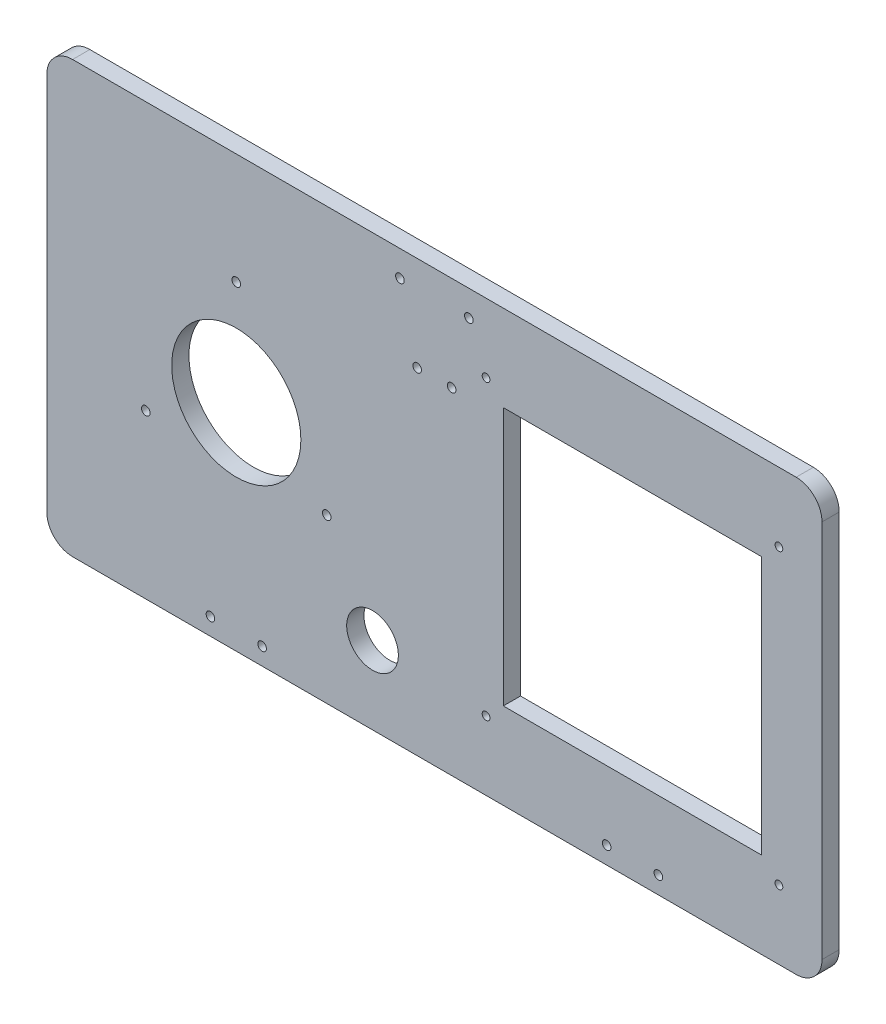
ISO-10303-21;
HEADER;
FILE_DESCRIPTION(('STEP AP214'),'2;1');
FILE_NAME('part.step','',(''),(''),'','','');
FILE_SCHEMA(('AUTOMOTIVE_DESIGN { 1 0 10303 214 1 1 1 1 }'));
ENDSEC;
DATA;
#1=APPLICATION_CONTEXT('core data for automotive mechanical design processes');
#2=APPLICATION_PROTOCOL_DEFINITION('international standard','automotive_design',2000,#1);
#3=PRODUCT_CONTEXT('',#1,'mechanical');
#4=PRODUCT('Part','Part','',(#3));
#5=PRODUCT_RELATED_PRODUCT_CATEGORY('part','',(#4));
#6=PRODUCT_DEFINITION_FORMATION('','',#4);
#7=PRODUCT_DEFINITION_CONTEXT('part definition',#1,'design');
#8=PRODUCT_DEFINITION('design','',#6,#7);
#9=PRODUCT_DEFINITION_SHAPE('','',#8);
#10=(LENGTH_UNIT() NAMED_UNIT(*) SI_UNIT(.MILLI.,.METRE.));
#11=(NAMED_UNIT(*) PLANE_ANGLE_UNIT() SI_UNIT($,.RADIAN.));
#12=(NAMED_UNIT(*) SI_UNIT($,.STERADIAN.) SOLID_ANGLE_UNIT());
#13=UNCERTAINTY_MEASURE_WITH_UNIT(LENGTH_MEASURE(1.E-05),#10,'distance_accuracy_value','');
#14=(GEOMETRIC_REPRESENTATION_CONTEXT(3) GLOBAL_UNCERTAINTY_ASSIGNED_CONTEXT((#13)) GLOBAL_UNIT_ASSIGNED_CONTEXT((#10,
#11,#12)) REPRESENTATION_CONTEXT('',''));
#15=CARTESIAN_POINT('',(0.,0.,0.));
#16=DIRECTION('',(0.,0.,1.));
#17=DIRECTION('',(1.,0.,0.));
#18=AXIS2_PLACEMENT_3D('',#15,#16,#17);
#19=CARTESIAN_POINT('',(435.,235.,10.));
#20=DIRECTION('',(0.,0.,-1.));
#21=DIRECTION('',(-1.,0.,0.));
#22=AXIS2_PLACEMENT_3D('',#19,#20,#21);
#23=PLANE('',#22);
#24=CARTESIAN_POINT('',(435.,235.,10.));
#25=DIRECTION('',(0.,0.,1.));
#26=DIRECTION('',(-1.,0.,0.));
#27=AXIS2_PLACEMENT_3D('',#24,#25,#26);
#28=CIRCLE('',#27,15.);
#29=CARTESIAN_POINT('',(450.,235.,10.));
#30=VERTEX_POINT('',#29);
#31=CARTESIAN_POINT('',(435.,250.,10.));
#32=VERTEX_POINT('',#31);
#33=EDGE_CURVE('E180',#30,#32,#28,.T.);
#34=ORIENTED_EDGE('',*,*,#33,.T.);
#35=DIRECTION('',(-1.,0.,0.));
#36=VECTOR('',#35,1.);
#37=CARTESIAN_POINT('',(15.,250.,10.));
#38=LINE('',#37,#36);
#39=CARTESIAN_POINT('',(15.,250.,10.));
#40=VERTEX_POINT('',#39);
#41=EDGE_CURVE('E184',#32,#40,#38,.T.);
#42=ORIENTED_EDGE('',*,*,#41,.T.);
#43=CARTESIAN_POINT('',(15.,235.,10.));
#44=DIRECTION('',(0.,0.,1.));
#45=DIRECTION('',(-1.,0.,0.));
#46=AXIS2_PLACEMENT_3D('',#43,#44,#45);
#47=CIRCLE('',#46,15.);
#48=CARTESIAN_POINT('',(0.,235.,10.));
#49=VERTEX_POINT('',#48);
#50=EDGE_CURVE('E188',#40,#49,#47,.T.);
#51=ORIENTED_EDGE('',*,*,#50,.T.);
#52=DIRECTION('',(0.,-1.,0.));
#53=VECTOR('',#52,1.);
#54=CARTESIAN_POINT('',(0.,15.0000000000001,10.));
#55=LINE('',#54,#53);
#56=CARTESIAN_POINT('',(0.,15.0000000000001,10.));
#57=VERTEX_POINT('',#56);
#58=EDGE_CURVE('E191',#49,#57,#55,.T.);
#59=ORIENTED_EDGE('',*,*,#58,.T.);
#60=CARTESIAN_POINT('',(15.,15.,10.));
#61=DIRECTION('',(0.,0.,1.));
#62=DIRECTION('',(-1.,0.,0.));
#63=AXIS2_PLACEMENT_3D('',#60,#61,#62);
#64=CIRCLE('',#63,15.);
#65=CARTESIAN_POINT('',(15.0000000000001,0.,10.));
#66=VERTEX_POINT('',#65);
#67=EDGE_CURVE('E194',#57,#66,#64,.T.);
#68=ORIENTED_EDGE('',*,*,#67,.T.);
#69=DIRECTION('',(1.,0.,0.));
#70=VECTOR('',#69,1.);
#71=CARTESIAN_POINT('',(15.0000000000001,0.,10.));
#72=LINE('',#71,#70);
#73=CARTESIAN_POINT('',(435.,0.,10.));
#74=VERTEX_POINT('',#73);
#75=EDGE_CURVE('E197',#66,#74,#72,.T.);
#76=ORIENTED_EDGE('',*,*,#75,.T.);
#77=CARTESIAN_POINT('',(435.,15.,10.));
#78=DIRECTION('',(0.,0.,1.));
#79=DIRECTION('',(1.,0.,0.));
#80=AXIS2_PLACEMENT_3D('',#77,#78,#79);
#81=CIRCLE('',#80,15.);
#82=CARTESIAN_POINT('',(450.,15.,10.));
#83=VERTEX_POINT('',#82);
#84=EDGE_CURVE('E200',#74,#83,#81,.T.);
#85=ORIENTED_EDGE('',*,*,#84,.T.);
#86=DIRECTION('',(0.,1.,0.));
#87=VECTOR('',#86,1.);
#88=CARTESIAN_POINT('',(450.,15.,10.));
#89=LINE('',#88,#87);
#90=EDGE_CURVE('E203',#83,#30,#89,.T.);
#91=ORIENTED_EDGE('',*,*,#90,.T.);
#92=EDGE_LOOP('',(#34,#42,#51,#59,#68,#76,#85,#91));
#93=FACE_BOUND('',#92,.T.);
#94=DIRECTION('',(0.,-1.,0.));
#95=VECTOR('',#94,1.);
#96=CARTESIAN_POINT('',(265.,50.,10.));
#97=LINE('',#96,#95);
#98=CARTESIAN_POINT('',(265.,200.,10.));
#99=VERTEX_POINT('',#98);
#100=CARTESIAN_POINT('',(265.,50.,10.));
#101=VERTEX_POINT('',#100);
#102=EDGE_CURVE('E129',#99,#101,#97,.T.);
#103=ORIENTED_EDGE('',*,*,#102,.F.);
#104=DIRECTION('',(-1.,0.,0.));
#105=VECTOR('',#104,1.);
#106=CARTESIAN_POINT('',(265.,200.,10.));
#107=LINE('',#106,#105);
#108=CARTESIAN_POINT('',(415.,200.,10.));
#109=VERTEX_POINT('',#108);
#110=EDGE_CURVE('E156',#109,#99,#107,.T.);
#111=ORIENTED_EDGE('',*,*,#110,.F.);
#112=DIRECTION('',(0.,1.,0.));
#113=VECTOR('',#112,1.);
#114=CARTESIAN_POINT('',(415.,50.,10.));
#115=LINE('',#114,#113);
#116=CARTESIAN_POINT('',(415.,50.,10.));
#117=VERTEX_POINT('',#116);
#118=EDGE_CURVE('E152',#117,#109,#115,.T.);
#119=ORIENTED_EDGE('',*,*,#118,.F.);
#120=DIRECTION('',(1.,0.,0.));
#121=VECTOR('',#120,1.);
#122=CARTESIAN_POINT('',(265.,50.,10.));
#123=LINE('',#122,#121);
#124=EDGE_CURVE('E138',#101,#117,#123,.T.);
#125=ORIENTED_EDGE('',*,*,#124,.F.);
#126=EDGE_LOOP('',(#103,#111,#119,#125));
#127=FACE_BOUND('',#126,.T.);
#128=CARTESIAN_POINT('',(110.,185.621778264911,10.));
#129=DIRECTION('',(0.,0.,1.));
#130=DIRECTION('',(1.,0.,0.));
#131=AXIS2_PLACEMENT_3D('',#128,#129,#130);
#132=CIRCLE('',#131,2.50000000000001);
#133=CARTESIAN_POINT('',(112.5,185.621778264911,10.));
#134=VERTEX_POINT('',#133);
#135=EDGE_CURVE('E164',#134,#134,#132,.T.);
#136=ORIENTED_EDGE('',*,*,#135,.F.);
#137=EDGE_LOOP('',(#136));
#138=FACE_BOUND('',#137,.T.);
#139=CARTESIAN_POINT('',(57.5000000000001,94.6891108675446,10.));
#140=DIRECTION('',(0.,0.,1.));
#141=DIRECTION('',(1.,0.,0.));
#142=AXIS2_PLACEMENT_3D('',#139,#140,#141);
#143=CIRCLE('',#142,2.5);
#144=CARTESIAN_POINT('',(60.0000000000001,94.6891108675446,10.));
#145=VERTEX_POINT('',#144);
#146=EDGE_CURVE('E525',#145,#145,#143,.T.);
#147=ORIENTED_EDGE('',*,*,#146,.F.);
#148=EDGE_LOOP('',(#147));
#149=FACE_BOUND('',#148,.T.);
#150=CARTESIAN_POINT('',(162.5,94.6891108675446,10.));
#151=DIRECTION('',(0.,0.,1.));
#152=DIRECTION('',(1.,0.,0.));
#153=AXIS2_PLACEMENT_3D('',#150,#151,#152);
#154=CIRCLE('',#153,2.5);
#155=CARTESIAN_POINT('',(165.,94.6891108675446,10.));
#156=VERTEX_POINT('',#155);
#157=EDGE_CURVE('E517',#156,#156,#154,.T.);
#158=ORIENTED_EDGE('',*,*,#157,.F.);
#159=EDGE_LOOP('',(#158));
#160=FACE_BOUND('',#159,.T.);
#161=CARTESIAN_POINT('',(110.,125.,10.));
#162=DIRECTION('',(0.,0.,1.));
#163=DIRECTION('',(1.,0.,0.));
#164=AXIS2_PLACEMENT_3D('',#161,#162,#163);
#165=CIRCLE('',#164,37.5);
#166=CARTESIAN_POINT('',(147.5,125.,10.));
#167=VERTEX_POINT('',#166);
#168=EDGE_CURVE('E509',#167,#167,#165,.T.);
#169=ORIENTED_EDGE('',*,*,#168,.F.);
#170=EDGE_LOOP('',(#169));
#171=FACE_BOUND('',#170,.T.);
#172=CARTESIAN_POINT('',(325.,10.,10.));
#173=DIRECTION('',(0.,0.,1.));
#174=DIRECTION('',(1.,0.,0.));
#175=AXIS2_PLACEMENT_3D('',#172,#173,#174);
#176=CIRCLE('',#175,2.50000000000002);
#177=CARTESIAN_POINT('',(327.5,10.,10.));
#178=VERTEX_POINT('',#177);
#179=EDGE_CURVE('E501',#178,#178,#176,.T.);
#180=ORIENTED_EDGE('',*,*,#179,.F.);
#181=EDGE_LOOP('',(#180));
#182=FACE_BOUND('',#181,.T.);
#183=CARTESIAN_POINT('',(355.,10.,10.));
#184=DIRECTION('',(0.,0.,1.));
#185=DIRECTION('',(1.,0.,0.));
#186=AXIS2_PLACEMENT_3D('',#183,#184,#185);
#187=CIRCLE('',#186,2.50000000000002);
#188=CARTESIAN_POINT('',(357.5,10.,10.));
#189=VERTEX_POINT('',#188);
#190=EDGE_CURVE('E493',#189,#189,#187,.T.);
#191=ORIENTED_EDGE('',*,*,#190,.F.);
#192=EDGE_LOOP('',(#191));
#193=FACE_BOUND('',#192,.T.);
#194=CARTESIAN_POINT('',(95.0000000000001,9.99999999999994,10.));
#195=DIRECTION('',(0.,0.,1.));
#196=DIRECTION('',(-1.,0.,0.));
#197=AXIS2_PLACEMENT_3D('',#194,#195,#196);
#198=CIRCLE('',#197,2.5);
#199=CARTESIAN_POINT('',(92.5000000000001,9.99999999999994,10.));
#200=VERTEX_POINT('',#199);
#201=EDGE_CURVE('E485',#200,#200,#198,.T.);
#202=ORIENTED_EDGE('',*,*,#201,.F.);
#203=EDGE_LOOP('',(#202));
#204=FACE_BOUND('',#203,.T.);
#205=CARTESIAN_POINT('',(125.,9.99999999999994,10.));
#206=DIRECTION('',(0.,0.,1.));
#207=DIRECTION('',(-1.,0.,0.));
#208=AXIS2_PLACEMENT_3D('',#205,#206,#207);
#209=CIRCLE('',#208,2.5);
#210=CARTESIAN_POINT('',(122.5,9.99999999999994,10.));
#211=VERTEX_POINT('',#210);
#212=EDGE_CURVE('E477',#211,#211,#209,.T.);
#213=ORIENTED_EDGE('',*,*,#212,.F.);
#214=EDGE_LOOP('',(#213));
#215=FACE_BOUND('',#214,.T.);
#216=CARTESIAN_POINT('',(205.,235.,10.));
#217=DIRECTION('',(0.,0.,1.));
#218=DIRECTION('',(1.,0.,0.));
#219=AXIS2_PLACEMENT_3D('',#216,#217,#218);
#220=CIRCLE('',#219,2.5);
#221=CARTESIAN_POINT('',(207.5,235.,10.));
#222=VERTEX_POINT('',#221);
#223=EDGE_CURVE('E469',#222,#222,#220,.T.);
#224=ORIENTED_EDGE('',*,*,#223,.F.);
#225=EDGE_LOOP('',(#224));
#226=FACE_BOUND('',#225,.T.);
#227=CARTESIAN_POINT('',(245.,235.,10.));
#228=DIRECTION('',(0.,0.,1.));
#229=DIRECTION('',(1.,0.,0.));
#230=AXIS2_PLACEMENT_3D('',#227,#228,#229);
#231=CIRCLE('',#230,2.50000000000002);
#232=CARTESIAN_POINT('',(247.5,235.,10.));
#233=VERTEX_POINT('',#232);
#234=EDGE_CURVE('E461',#233,#233,#231,.T.);
#235=ORIENTED_EDGE('',*,*,#234,.F.);
#236=EDGE_LOOP('',(#235));
#237=FACE_BOUND('',#236,.T.);
#238=CARTESIAN_POINT('',(189.096460097782,45.,10.));
#239=DIRECTION('',(0.,0.,1.));
#240=DIRECTION('',(1.,0.,0.));
#241=AXIS2_PLACEMENT_3D('',#238,#239,#240);
#242=CIRCLE('',#241,15.);
#243=CARTESIAN_POINT('',(204.096460097782,45.,10.));
#244=VERTEX_POINT('',#243);
#245=EDGE_CURVE('E453',#244,#244,#242,.T.);
#246=ORIENTED_EDGE('',*,*,#245,.F.);
#247=EDGE_LOOP('',(#246));
#248=FACE_BOUND('',#247,.T.);
#249=CARTESIAN_POINT('',(425.,210.,10.));
#250=DIRECTION('',(0.,0.,1.));
#251=DIRECTION('',(1.,0.,0.));
#252=AXIS2_PLACEMENT_3D('',#249,#250,#251);
#253=CIRCLE('',#252,2.24999999999996);
#254=CARTESIAN_POINT('',(427.25,210.,10.));
#255=VERTEX_POINT('',#254);
#256=EDGE_CURVE('E445',#255,#255,#253,.T.);
#257=ORIENTED_EDGE('',*,*,#256,.F.);
#258=EDGE_LOOP('',(#257));
#259=FACE_BOUND('',#258,.T.);
#260=CARTESIAN_POINT('',(255.,210.,10.));
#261=DIRECTION('',(0.,0.,1.));
#262=DIRECTION('',(1.,0.,0.));
#263=AXIS2_PLACEMENT_3D('',#260,#261,#262);
#264=CIRCLE('',#263,2.24999999999996);
#265=CARTESIAN_POINT('',(257.25,210.,10.));
#266=VERTEX_POINT('',#265);
#267=EDGE_CURVE('E437',#266,#266,#264,.T.);
#268=ORIENTED_EDGE('',*,*,#267,.F.);
#269=EDGE_LOOP('',(#268));
#270=FACE_BOUND('',#269,.T.);
#271=CARTESIAN_POINT('',(255.,40.,10.));
#272=DIRECTION('',(0.,0.,1.));
#273=DIRECTION('',(1.,0.,0.));
#274=AXIS2_PLACEMENT_3D('',#271,#272,#273);
#275=CIRCLE('',#274,2.24999999999995);
#276=CARTESIAN_POINT('',(257.25,40.,10.));
#277=VERTEX_POINT('',#276);
#278=EDGE_CURVE('E429',#277,#277,#275,.T.);
#279=ORIENTED_EDGE('',*,*,#278,.F.);
#280=EDGE_LOOP('',(#279));
#281=FACE_BOUND('',#280,.T.);
#282=CARTESIAN_POINT('',(425.,40.,10.));
#283=DIRECTION('',(0.,0.,1.));
#284=DIRECTION('',(1.,0.,0.));
#285=AXIS2_PLACEMENT_3D('',#282,#283,#284);
#286=CIRCLE('',#285,2.24999999999995);
#287=CARTESIAN_POINT('',(427.25,40.,10.));
#288=VERTEX_POINT('',#287);
#289=EDGE_CURVE('E421',#288,#288,#286,.T.);
#290=ORIENTED_EDGE('',*,*,#289,.F.);
#291=EDGE_LOOP('',(#290));
#292=FACE_BOUND('',#291,.T.);
#293=CARTESIAN_POINT('',(215.,195.,10.));
#294=DIRECTION('',(0.,0.,1.));
#295=DIRECTION('',(1.,0.,0.));
#296=AXIS2_PLACEMENT_3D('',#293,#294,#295);
#297=CIRCLE('',#296,2.5);
#298=CARTESIAN_POINT('',(217.5,195.,10.));
#299=VERTEX_POINT('',#298);
#300=EDGE_CURVE('E413',#299,#299,#297,.T.);
#301=ORIENTED_EDGE('',*,*,#300,.F.);
#302=EDGE_LOOP('',(#301));
#303=FACE_BOUND('',#302,.T.);
#304=CARTESIAN_POINT('',(235.,195.,10.));
#305=DIRECTION('',(0.,0.,1.));
#306=DIRECTION('',(1.,0.,0.));
#307=AXIS2_PLACEMENT_3D('',#304,#305,#306);
#308=CIRCLE('',#307,2.5);
#309=CARTESIAN_POINT('',(237.5,195.,10.));
#310=VERTEX_POINT('',#309);
#311=EDGE_CURVE('E402',#310,#310,#308,.T.);
#312=ORIENTED_EDGE('',*,*,#311,.F.);
#313=EDGE_LOOP('',(#312));
#314=FACE_BOUND('',#313,.T.);
#315=ADVANCED_FACE('F39',(#93,#127,#138,#149,#160,#171,#182,#193,#204,#215,#226,#237,#248,#259,
#270,#281,#292,#303,#314),#23,.F.);
#316=CARTESIAN_POINT('',(435.,235.,0.));
#317=DIRECTION('',(0.,0.,-1.));
#318=DIRECTION('',(-1.,0.,0.));
#319=AXIS2_PLACEMENT_3D('',#316,#317,#318);
#320=PLANE('',#319);
#321=CARTESIAN_POINT('',(215.,195.,0.));
#322=DIRECTION('',(0.,0.,1.));
#323=DIRECTION('',(1.,0.,0.));
#324=AXIS2_PLACEMENT_3D('',#321,#322,#323);
#325=CIRCLE('',#324,2.5);
#326=CARTESIAN_POINT('',(217.5,195.,0.));
#327=VERTEX_POINT('',#326);
#328=EDGE_CURVE('E410',#327,#327,#325,.T.);
#329=ORIENTED_EDGE('',*,*,#328,.T.);
#330=EDGE_LOOP('',(#329));
#331=FACE_BOUND('',#330,.T.);
#332=CARTESIAN_POINT('',(255.,40.,0.));
#333=DIRECTION('',(0.,0.,1.));
#334=DIRECTION('',(1.,0.,0.));
#335=AXIS2_PLACEMENT_3D('',#332,#333,#334);
#336=CIRCLE('',#335,2.24999999999995);
#337=CARTESIAN_POINT('',(257.25,40.,0.));
#338=VERTEX_POINT('',#337);
#339=EDGE_CURVE('E425',#338,#338,#336,.T.);
#340=ORIENTED_EDGE('',*,*,#339,.T.);
#341=EDGE_LOOP('',(#340));
#342=FACE_BOUND('',#341,.T.);
#343=CARTESIAN_POINT('',(425.,210.,0.));
#344=DIRECTION('',(0.,0.,1.));
#345=DIRECTION('',(1.,0.,0.));
#346=AXIS2_PLACEMENT_3D('',#343,#344,#345);
#347=CIRCLE('',#346,2.24999999999996);
#348=CARTESIAN_POINT('',(427.25,210.,0.));
#349=VERTEX_POINT('',#348);
#350=EDGE_CURVE('E441',#349,#349,#347,.T.);
#351=ORIENTED_EDGE('',*,*,#350,.T.);
#352=EDGE_LOOP('',(#351));
#353=FACE_BOUND('',#352,.T.);
#354=CARTESIAN_POINT('',(245.,235.,0.));
#355=DIRECTION('',(0.,0.,1.));
#356=DIRECTION('',(1.,0.,0.));
#357=AXIS2_PLACEMENT_3D('',#354,#355,#356);
#358=CIRCLE('',#357,2.50000000000002);
#359=CARTESIAN_POINT('',(247.5,235.,0.));
#360=VERTEX_POINT('',#359);
#361=EDGE_CURVE('E457',#360,#360,#358,.T.);
#362=ORIENTED_EDGE('',*,*,#361,.T.);
#363=EDGE_LOOP('',(#362));
#364=FACE_BOUND('',#363,.T.);
#365=CARTESIAN_POINT('',(125.,9.99999999999994,0.));
#366=DIRECTION('',(0.,0.,1.));
#367=DIRECTION('',(-1.,0.,0.));
#368=AXIS2_PLACEMENT_3D('',#365,#366,#367);
#369=CIRCLE('',#368,2.5);
#370=CARTESIAN_POINT('',(122.5,9.99999999999994,0.));
#371=VERTEX_POINT('',#370);
#372=EDGE_CURVE('E473',#371,#371,#369,.T.);
#373=ORIENTED_EDGE('',*,*,#372,.T.);
#374=EDGE_LOOP('',(#373));
#375=FACE_BOUND('',#374,.T.);
#376=CARTESIAN_POINT('',(355.,10.,0.));
#377=DIRECTION('',(0.,0.,1.));
#378=DIRECTION('',(1.,0.,0.));
#379=AXIS2_PLACEMENT_3D('',#376,#377,#378);
#380=CIRCLE('',#379,2.50000000000002);
#381=CARTESIAN_POINT('',(357.5,10.,0.));
#382=VERTEX_POINT('',#381);
#383=EDGE_CURVE('E489',#382,#382,#380,.T.);
#384=ORIENTED_EDGE('',*,*,#383,.T.);
#385=EDGE_LOOP('',(#384));
#386=FACE_BOUND('',#385,.T.);
#387=CARTESIAN_POINT('',(110.,125.,0.));
#388=DIRECTION('',(0.,0.,1.));
#389=DIRECTION('',(1.,0.,0.));
#390=AXIS2_PLACEMENT_3D('',#387,#388,#389);
#391=CIRCLE('',#390,37.5);
#392=CARTESIAN_POINT('',(147.5,125.,0.));
#393=VERTEX_POINT('',#392);
#394=EDGE_CURVE('E505',#393,#393,#391,.T.);
#395=ORIENTED_EDGE('',*,*,#394,.T.);
#396=EDGE_LOOP('',(#395));
#397=FACE_BOUND('',#396,.T.);
#398=CARTESIAN_POINT('',(57.5000000000001,94.6891108675446,0.));
#399=DIRECTION('',(0.,0.,1.));
#400=DIRECTION('',(1.,0.,0.));
#401=AXIS2_PLACEMENT_3D('',#398,#399,#400);
#402=CIRCLE('',#401,2.5);
#403=CARTESIAN_POINT('',(60.0000000000001,94.6891108675446,0.));
#404=VERTEX_POINT('',#403);
#405=EDGE_CURVE('E521',#404,#404,#402,.T.);
#406=ORIENTED_EDGE('',*,*,#405,.T.);
#407=EDGE_LOOP('',(#406));
#408=FACE_BOUND('',#407,.T.);
#409=DIRECTION('',(-1.,0.,0.));
#410=VECTOR('',#409,1.);
#411=CARTESIAN_POINT('',(265.,200.,0.));
#412=LINE('',#411,#410);
#413=CARTESIAN_POINT('',(415.,200.,0.));
#414=VERTEX_POINT('',#413);
#415=CARTESIAN_POINT('',(265.,200.,0.));
#416=VERTEX_POINT('',#415);
#417=EDGE_CURVE('E139',#414,#416,#412,.T.);
#418=ORIENTED_EDGE('',*,*,#417,.T.);
#419=DIRECTION('',(0.,-1.,0.));
#420=VECTOR('',#419,1.);
#421=CARTESIAN_POINT('',(265.,50.,0.));
#422=LINE('',#421,#420);
#423=CARTESIAN_POINT('',(265.,50.,0.));
#424=VERTEX_POINT('',#423);
#425=EDGE_CURVE('E63',#416,#424,#422,.T.);
#426=ORIENTED_EDGE('',*,*,#425,.T.);
#427=DIRECTION('',(1.,0.,0.));
#428=VECTOR('',#427,1.);
#429=CARTESIAN_POINT('',(265.,50.,0.));
#430=LINE('',#429,#428);
#431=CARTESIAN_POINT('',(415.,50.,0.));
#432=VERTEX_POINT('',#431);
#433=EDGE_CURVE('E145',#424,#432,#430,.T.);
#434=ORIENTED_EDGE('',*,*,#433,.T.);
#435=DIRECTION('',(0.,1.,0.));
#436=VECTOR('',#435,1.);
#437=CARTESIAN_POINT('',(415.,50.,0.));
#438=LINE('',#437,#436);
#439=EDGE_CURVE('E167',#432,#414,#438,.T.);
#440=ORIENTED_EDGE('',*,*,#439,.T.);
#441=EDGE_LOOP('',(#418,#426,#434,#440));
#442=FACE_BOUND('',#441,.T.);
#443=CARTESIAN_POINT('',(435.,235.,0.));
#444=DIRECTION('',(0.,0.,1.));
#445=DIRECTION('',(-1.,0.,0.));
#446=AXIS2_PLACEMENT_3D('',#443,#444,#445);
#447=CIRCLE('',#446,15.);
#448=CARTESIAN_POINT('',(450.,235.,0.));
#449=VERTEX_POINT('',#448);
#450=CARTESIAN_POINT('',(435.,250.,0.));
#451=VERTEX_POINT('',#450);
#452=EDGE_CURVE('E147',#449,#451,#447,.T.);
#453=ORIENTED_EDGE('',*,*,#452,.F.);
#454=DIRECTION('',(0.,1.,0.));
#455=VECTOR('',#454,1.);
#456=CARTESIAN_POINT('',(450.,15.,0.));
#457=LINE('',#456,#455);
#458=CARTESIAN_POINT('',(450.,15.,0.));
#459=VERTEX_POINT('',#458);
#460=EDGE_CURVE('E185',#459,#449,#457,.T.);
#461=ORIENTED_EDGE('',*,*,#460,.F.);
#462=CARTESIAN_POINT('',(435.,15.,0.));
#463=DIRECTION('',(0.,0.,1.));
#464=DIRECTION('',(1.,0.,0.));
#465=AXIS2_PLACEMENT_3D('',#462,#463,#464);
#466=CIRCLE('',#465,15.);
#467=CARTESIAN_POINT('',(435.,0.,0.));
#468=VERTEX_POINT('',#467);
#469=EDGE_CURVE('E225',#468,#459,#466,.T.);
#470=ORIENTED_EDGE('',*,*,#469,.F.);
#471=DIRECTION('',(1.,0.,0.));
#472=VECTOR('',#471,1.);
#473=CARTESIAN_POINT('',(15.0000000000001,0.,0.));
#474=LINE('',#473,#472);
#475=CARTESIAN_POINT('',(15.0000000000001,0.,0.));
#476=VERTEX_POINT('',#475);
#477=EDGE_CURVE('E222',#476,#468,#474,.T.);
#478=ORIENTED_EDGE('',*,*,#477,.F.);
#479=CARTESIAN_POINT('',(15.,15.,0.));
#480=DIRECTION('',(0.,0.,1.));
#481=DIRECTION('',(-1.,0.,0.));
#482=AXIS2_PLACEMENT_3D('',#479,#480,#481);
#483=CIRCLE('',#482,15.);
#484=CARTESIAN_POINT('',(0.,15.0000000000001,0.));
#485=VERTEX_POINT('',#484);
#486=EDGE_CURVE('E219',#485,#476,#483,.T.);
#487=ORIENTED_EDGE('',*,*,#486,.F.);
#488=DIRECTION('',(0.,-1.,0.));
#489=VECTOR('',#488,1.);
#490=CARTESIAN_POINT('',(0.,15.0000000000001,0.));
#491=LINE('',#490,#489);
#492=CARTESIAN_POINT('',(0.,235.,0.));
#493=VERTEX_POINT('',#492);
#494=EDGE_CURVE('E216',#493,#485,#491,.T.);
#495=ORIENTED_EDGE('',*,*,#494,.F.);
#496=CARTESIAN_POINT('',(15.,235.,0.));
#497=DIRECTION('',(0.,0.,1.));
#498=DIRECTION('',(-1.,0.,0.));
#499=AXIS2_PLACEMENT_3D('',#496,#497,#498);
#500=CIRCLE('',#499,15.);
#501=CARTESIAN_POINT('',(15.,250.,0.));
#502=VERTEX_POINT('',#501);
#503=EDGE_CURVE('E213',#502,#493,#500,.T.);
#504=ORIENTED_EDGE('',*,*,#503,.F.);
#505=DIRECTION('',(-1.,0.,0.));
#506=VECTOR('',#505,1.);
#507=CARTESIAN_POINT('',(15.,250.,0.));
#508=LINE('',#507,#506);
#509=EDGE_CURVE('E210',#451,#502,#508,.T.);
#510=ORIENTED_EDGE('',*,*,#509,.F.);
#511=EDGE_LOOP('',(#453,#461,#470,#478,#487,#495,#504,#510));
#512=FACE_BOUND('',#511,.T.);
#513=CARTESIAN_POINT('',(110.,185.621778264911,0.));
#514=DIRECTION('',(0.,0.,1.));
#515=DIRECTION('',(1.,0.,0.));
#516=AXIS2_PLACEMENT_3D('',#513,#514,#515);
#517=CIRCLE('',#516,2.50000000000001);
#518=CARTESIAN_POINT('',(112.5,185.621778264911,0.));
#519=VERTEX_POINT('',#518);
#520=EDGE_CURVE('E529',#519,#519,#517,.T.);
#521=ORIENTED_EDGE('',*,*,#520,.T.);
#522=EDGE_LOOP('',(#521));
#523=FACE_BOUND('',#522,.T.);
#524=CARTESIAN_POINT('',(162.5,94.6891108675446,0.));
#525=DIRECTION('',(0.,0.,1.));
#526=DIRECTION('',(1.,0.,0.));
#527=AXIS2_PLACEMENT_3D('',#524,#525,#526);
#528=CIRCLE('',#527,2.5);
#529=CARTESIAN_POINT('',(165.,94.6891108675446,0.));
#530=VERTEX_POINT('',#529);
#531=EDGE_CURVE('E513',#530,#530,#528,.T.);
#532=ORIENTED_EDGE('',*,*,#531,.T.);
#533=EDGE_LOOP('',(#532));
#534=FACE_BOUND('',#533,.T.);
#535=CARTESIAN_POINT('',(325.,10.,0.));
#536=DIRECTION('',(0.,0.,1.));
#537=DIRECTION('',(1.,0.,0.));
#538=AXIS2_PLACEMENT_3D('',#535,#536,#537);
#539=CIRCLE('',#538,2.50000000000002);
#540=CARTESIAN_POINT('',(327.5,10.,0.));
#541=VERTEX_POINT('',#540);
#542=EDGE_CURVE('E497',#541,#541,#539,.T.);
#543=ORIENTED_EDGE('',*,*,#542,.T.);
#544=EDGE_LOOP('',(#543));
#545=FACE_BOUND('',#544,.T.);
#546=CARTESIAN_POINT('',(95.0000000000001,9.99999999999994,0.));
#547=DIRECTION('',(0.,0.,1.));
#548=DIRECTION('',(-1.,0.,0.));
#549=AXIS2_PLACEMENT_3D('',#546,#547,#548);
#550=CIRCLE('',#549,2.5);
#551=CARTESIAN_POINT('',(92.5000000000001,9.99999999999994,0.));
#552=VERTEX_POINT('',#551);
#553=EDGE_CURVE('E481',#552,#552,#550,.T.);
#554=ORIENTED_EDGE('',*,*,#553,.T.);
#555=EDGE_LOOP('',(#554));
#556=FACE_BOUND('',#555,.T.);
#557=CARTESIAN_POINT('',(205.,235.,0.));
#558=DIRECTION('',(0.,0.,1.));
#559=DIRECTION('',(1.,0.,0.));
#560=AXIS2_PLACEMENT_3D('',#557,#558,#559);
#561=CIRCLE('',#560,2.5);
#562=CARTESIAN_POINT('',(207.5,235.,0.));
#563=VERTEX_POINT('',#562);
#564=EDGE_CURVE('E465',#563,#563,#561,.T.);
#565=ORIENTED_EDGE('',*,*,#564,.T.);
#566=EDGE_LOOP('',(#565));
#567=FACE_BOUND('',#566,.T.);
#568=CARTESIAN_POINT('',(189.096460097782,45.,0.));
#569=DIRECTION('',(0.,0.,1.));
#570=DIRECTION('',(1.,0.,0.));
#571=AXIS2_PLACEMENT_3D('',#568,#569,#570);
#572=CIRCLE('',#571,15.);
#573=CARTESIAN_POINT('',(204.096460097782,45.,0.));
#574=VERTEX_POINT('',#573);
#575=EDGE_CURVE('E449',#574,#574,#572,.T.);
#576=ORIENTED_EDGE('',*,*,#575,.T.);
#577=EDGE_LOOP('',(#576));
#578=FACE_BOUND('',#577,.T.);
#579=CARTESIAN_POINT('',(255.,210.,0.));
#580=DIRECTION('',(0.,0.,1.));
#581=DIRECTION('',(1.,0.,0.));
#582=AXIS2_PLACEMENT_3D('',#579,#580,#581);
#583=CIRCLE('',#582,2.24999999999996);
#584=CARTESIAN_POINT('',(257.25,210.,0.));
#585=VERTEX_POINT('',#584);
#586=EDGE_CURVE('E433',#585,#585,#583,.T.);
#587=ORIENTED_EDGE('',*,*,#586,.T.);
#588=EDGE_LOOP('',(#587));
#589=FACE_BOUND('',#588,.T.);
#590=CARTESIAN_POINT('',(425.,40.,0.));
#591=DIRECTION('',(0.,0.,1.));
#592=DIRECTION('',(1.,0.,0.));
#593=AXIS2_PLACEMENT_3D('',#590,#591,#592);
#594=CIRCLE('',#593,2.24999999999995);
#595=CARTESIAN_POINT('',(427.25,40.,0.));
#596=VERTEX_POINT('',#595);
#597=EDGE_CURVE('E417',#596,#596,#594,.T.);
#598=ORIENTED_EDGE('',*,*,#597,.T.);
#599=EDGE_LOOP('',(#598));
#600=FACE_BOUND('',#599,.T.);
#601=CARTESIAN_POINT('',(235.,195.,0.));
#602=DIRECTION('',(0.,0.,1.));
#603=DIRECTION('',(1.,0.,0.));
#604=AXIS2_PLACEMENT_3D('',#601,#602,#603);
#605=CIRCLE('',#604,2.5);
#606=CARTESIAN_POINT('',(237.5,195.,0.));
#607=VERTEX_POINT('',#606);
#608=EDGE_CURVE('E405',#607,#607,#605,.T.);
#609=ORIENTED_EDGE('',*,*,#608,.T.);
#610=EDGE_LOOP('',(#609));
#611=FACE_BOUND('',#610,.T.);
#612=ADVANCED_FACE('F264',(#331,#342,#353,#364,#375,#386,#397,#408,#442,#512,#523,#534,#545,
#556,#567,#578,#589,#600,#611),#320,.T.);
#613=CARTESIAN_POINT('',(435.,235.,10.));
#614=DIRECTION('',(0.,0.,-1.));
#615=DIRECTION('',(-1.,0.,0.));
#616=AXIS2_PLACEMENT_3D('',#613,#614,#615);
#617=CYLINDRICAL_SURFACE('',#616,15.);
#618=ORIENTED_EDGE('',*,*,#452,.T.);
#619=DIRECTION('',(0.,0.,-1.));
#620=VECTOR('',#619,1.);
#621=CARTESIAN_POINT('',(435.,250.,10.));
#622=LINE('',#621,#620);
#623=EDGE_CURVE('E11',#32,#451,#622,.T.);
#624=ORIENTED_EDGE('',*,*,#623,.F.);
#625=ORIENTED_EDGE('',*,*,#33,.F.);
#626=DIRECTION('',(0.,0.,-1.));
#627=VECTOR('',#626,1.);
#628=CARTESIAN_POINT('',(450.,235.,10.));
#629=LINE('',#628,#627);
#630=EDGE_CURVE('E206',#30,#449,#629,.T.);
#631=ORIENTED_EDGE('',*,*,#630,.T.);
#632=EDGE_LOOP('',(#618,#624,#625,#631));
#633=FACE_BOUND('',#632,.T.);
#634=ADVANCED_FACE('F41',(#633),#617,.T.);
#635=CARTESIAN_POINT('',(15.,250.,10.));
#636=DIRECTION('',(0.,-1.,0.));
#637=DIRECTION('',(0.,0.,-1.));
#638=AXIS2_PLACEMENT_3D('',#635,#636,#637);
#639=PLANE('',#638);
#640=ORIENTED_EDGE('',*,*,#509,.T.);
#641=DIRECTION('',(0.,0.,-1.));
#642=VECTOR('',#641,1.);
#643=CARTESIAN_POINT('',(15.,250.,10.));
#644=LINE('',#643,#642);
#645=EDGE_CURVE('E48',#40,#502,#644,.T.);
#646=ORIENTED_EDGE('',*,*,#645,.F.);
#647=ORIENTED_EDGE('',*,*,#41,.F.);
#648=ORIENTED_EDGE('',*,*,#623,.T.);
#649=EDGE_LOOP('',(#640,#646,#647,#648));
#650=FACE_BOUND('',#649,.T.);
#651=ADVANCED_FACE('F281',(#650),#639,.F.);
#652=CARTESIAN_POINT('',(15.,235.,10.));
#653=DIRECTION('',(0.,0.,-1.));
#654=DIRECTION('',(-1.,0.,0.));
#655=AXIS2_PLACEMENT_3D('',#652,#653,#654);
#656=CYLINDRICAL_SURFACE('',#655,15.);
#657=ORIENTED_EDGE('',*,*,#503,.T.);
#658=DIRECTION('',(0.,0.,-1.));
#659=VECTOR('',#658,1.);
#660=CARTESIAN_POINT('',(0.,235.,10.));
#661=LINE('',#660,#659);
#662=EDGE_CURVE('E249',#49,#493,#661,.T.);
#663=ORIENTED_EDGE('',*,*,#662,.F.);
#664=ORIENTED_EDGE('',*,*,#50,.F.);
#665=ORIENTED_EDGE('',*,*,#645,.T.);
#666=EDGE_LOOP('',(#657,#663,#664,#665));
#667=FACE_BOUND('',#666,.T.);
#668=ADVANCED_FACE('F258',(#667),#656,.T.);
#669=CARTESIAN_POINT('',(0.,15.0000000000001,10.));
#670=DIRECTION('',(1.,0.,0.));
#671=DIRECTION('',(0.,0.,-1.));
#672=AXIS2_PLACEMENT_3D('',#669,#670,#671);
#673=PLANE('',#672);
#674=ORIENTED_EDGE('',*,*,#494,.T.);
#675=DIRECTION('',(0.,0.,-1.));
#676=VECTOR('',#675,1.);
#677=CARTESIAN_POINT('',(0.,15.0000000000001,10.));
#678=LINE('',#677,#676);
#679=EDGE_CURVE('E245',#57,#485,#678,.T.);
#680=ORIENTED_EDGE('',*,*,#679,.F.);
#681=ORIENTED_EDGE('',*,*,#58,.F.);
#682=ORIENTED_EDGE('',*,*,#662,.T.);
#683=EDGE_LOOP('',(#674,#680,#681,#682));
#684=FACE_BOUND('',#683,.T.);
#685=ADVANCED_FACE('F270',(#684),#673,.F.);
#686=CARTESIAN_POINT('',(15.,15.,10.));
#687=DIRECTION('',(0.,0.,-1.));
#688=DIRECTION('',(-1.,0.,0.));
#689=AXIS2_PLACEMENT_3D('',#686,#687,#688);
#690=CYLINDRICAL_SURFACE('',#689,15.);
#691=ORIENTED_EDGE('',*,*,#486,.T.);
#692=DIRECTION('',(0.,0.,-1.));
#693=VECTOR('',#692,1.);
#694=CARTESIAN_POINT('',(15.0000000000001,0.,10.));
#695=LINE('',#694,#693);
#696=EDGE_CURVE('E241',#66,#476,#695,.T.);
#697=ORIENTED_EDGE('',*,*,#696,.F.);
#698=ORIENTED_EDGE('',*,*,#67,.F.);
#699=ORIENTED_EDGE('',*,*,#679,.T.);
#700=EDGE_LOOP('',(#691,#697,#698,#699));
#701=FACE_BOUND('',#700,.T.);
#702=ADVANCED_FACE('F274',(#701),#690,.T.);
#703=CARTESIAN_POINT('',(15.0000000000001,0.,10.));
#704=DIRECTION('',(0.,1.,0.));
#705=DIRECTION('',(-1.,0.,0.));
#706=AXIS2_PLACEMENT_3D('',#703,#704,#705);
#707=PLANE('',#706);
#708=ORIENTED_EDGE('',*,*,#477,.T.);
#709=DIRECTION('',(0.,0.,-1.));
#710=VECTOR('',#709,1.);
#711=CARTESIAN_POINT('',(435.,0.,10.));
#712=LINE('',#711,#710);
#713=EDGE_CURVE('E237',#74,#468,#712,.T.);
#714=ORIENTED_EDGE('',*,*,#713,.F.);
#715=ORIENTED_EDGE('',*,*,#75,.F.);
#716=ORIENTED_EDGE('',*,*,#696,.T.);
#717=EDGE_LOOP('',(#708,#714,#715,#716));
#718=FACE_BOUND('',#717,.T.);
#719=ADVANCED_FACE('F294',(#718),#707,.F.);
#720=CARTESIAN_POINT('',(435.,15.,10.));
#721=DIRECTION('',(0.,0.,-1.));
#722=DIRECTION('',(-1.,0.,0.));
#723=AXIS2_PLACEMENT_3D('',#720,#721,#722);
#724=CYLINDRICAL_SURFACE('',#723,15.);
#725=ORIENTED_EDGE('',*,*,#469,.T.);
#726=DIRECTION('',(0.,0.,-1.));
#727=VECTOR('',#726,1.);
#728=CARTESIAN_POINT('',(450.,15.,10.));
#729=LINE('',#728,#727);
#730=EDGE_CURVE('E233',#83,#459,#729,.T.);
#731=ORIENTED_EDGE('',*,*,#730,.F.);
#732=ORIENTED_EDGE('',*,*,#84,.F.);
#733=ORIENTED_EDGE('',*,*,#713,.T.);
#734=EDGE_LOOP('',(#725,#731,#732,#733));
#735=FACE_BOUND('',#734,.T.);
#736=ADVANCED_FACE('F292',(#735),#724,.T.);
#737=CARTESIAN_POINT('',(450.,15.,10.));
#738=DIRECTION('',(-1.,0.,0.));
#739=DIRECTION('',(0.,0.,1.));
#740=AXIS2_PLACEMENT_3D('',#737,#738,#739);
#741=PLANE('',#740);
#742=ORIENTED_EDGE('',*,*,#460,.T.);
#743=ORIENTED_EDGE('',*,*,#630,.F.);
#744=ORIENTED_EDGE('',*,*,#90,.F.);
#745=ORIENTED_EDGE('',*,*,#730,.T.);
#746=EDGE_LOOP('',(#742,#743,#744,#745));
#747=FACE_BOUND('',#746,.T.);
#748=ADVANCED_FACE('F287',(#747),#741,.F.);
#749=CARTESIAN_POINT('',(265.,50.,10.));
#750=DIRECTION('',(1.,0.,0.));
#751=DIRECTION('',(0.,0.,-1.));
#752=AXIS2_PLACEMENT_3D('',#749,#750,#751);
#753=PLANE('',#752);
#754=ORIENTED_EDGE('',*,*,#425,.F.);
#755=DIRECTION('',(0.,0.,-1.));
#756=VECTOR('',#755,1.);
#757=CARTESIAN_POINT('',(265.,200.,10.));
#758=LINE('',#757,#756);
#759=EDGE_CURVE('E133',#99,#416,#758,.T.);
#760=ORIENTED_EDGE('',*,*,#759,.F.);
#761=ORIENTED_EDGE('',*,*,#102,.T.);
#762=DIRECTION('',(0.,0.,-1.));
#763=VECTOR('',#762,1.);
#764=CARTESIAN_POINT('',(265.,50.,10.));
#765=LINE('',#764,#763);
#766=EDGE_CURVE('E132',#101,#424,#765,.T.);
#767=ORIENTED_EDGE('',*,*,#766,.T.);
#768=EDGE_LOOP('',(#754,#760,#761,#767));
#769=FACE_BOUND('',#768,.T.);
#770=ADVANCED_FACE('F131',(#769),#753,.T.);
#771=CARTESIAN_POINT('',(265.,50.,10.));
#772=DIRECTION('',(0.,1.,0.));
#773=DIRECTION('',(0.,0.,1.));
#774=AXIS2_PLACEMENT_3D('',#771,#772,#773);
#775=PLANE('',#774);
#776=ORIENTED_EDGE('',*,*,#433,.F.);
#777=ORIENTED_EDGE('',*,*,#766,.F.);
#778=ORIENTED_EDGE('',*,*,#124,.T.);
#779=DIRECTION('',(0.,0.,-1.));
#780=VECTOR('',#779,1.);
#781=CARTESIAN_POINT('',(415.,50.,10.));
#782=LINE('',#781,#780);
#783=EDGE_CURVE('E148',#117,#432,#782,.T.);
#784=ORIENTED_EDGE('',*,*,#783,.T.);
#785=EDGE_LOOP('',(#776,#777,#778,#784));
#786=FACE_BOUND('',#785,.T.);
#787=ADVANCED_FACE('F142',(#786),#775,.T.);
#788=CARTESIAN_POINT('',(415.,50.,10.));
#789=DIRECTION('',(-1.,0.,0.));
#790=DIRECTION('',(0.,-1.,0.));
#791=AXIS2_PLACEMENT_3D('',#788,#789,#790);
#792=PLANE('',#791);
#793=ORIENTED_EDGE('',*,*,#439,.F.);
#794=ORIENTED_EDGE('',*,*,#783,.F.);
#795=ORIENTED_EDGE('',*,*,#118,.T.);
#796=DIRECTION('',(0.,0.,-1.));
#797=VECTOR('',#796,1.);
#798=CARTESIAN_POINT('',(415.,200.,10.));
#799=LINE('',#798,#797);
#800=EDGE_CURVE('E55',#109,#414,#799,.T.);
#801=ORIENTED_EDGE('',*,*,#800,.T.);
#802=EDGE_LOOP('',(#793,#794,#795,#801));
#803=FACE_BOUND('',#802,.T.);
#804=ADVANCED_FACE('F320',(#803),#792,.T.);
#805=CARTESIAN_POINT('',(265.,200.,10.));
#806=DIRECTION('',(0.,-1.,0.));
#807=DIRECTION('',(0.,0.,-1.));
#808=AXIS2_PLACEMENT_3D('',#805,#806,#807);
#809=PLANE('',#808);
#810=ORIENTED_EDGE('',*,*,#417,.F.);
#811=ORIENTED_EDGE('',*,*,#800,.F.);
#812=ORIENTED_EDGE('',*,*,#110,.T.);
#813=ORIENTED_EDGE('',*,*,#759,.T.);
#814=EDGE_LOOP('',(#810,#811,#812,#813));
#815=FACE_BOUND('',#814,.T.);
#816=ADVANCED_FACE('F324',(#815),#809,.T.);
#817=CARTESIAN_POINT('',(110.,185.621778264911,10.));
#818=DIRECTION('',(0.,0.,-1.));
#819=DIRECTION('',(-1.,0.,0.));
#820=AXIS2_PLACEMENT_3D('',#817,#818,#819);
#821=CYLINDRICAL_SURFACE('',#820,2.50000000000001);
#822=ORIENTED_EDGE('',*,*,#135,.T.);
#823=EDGE_LOOP('',(#822));
#824=FACE_BOUND('',#823,.T.);
#825=ORIENTED_EDGE('',*,*,#520,.F.);
#826=EDGE_LOOP('',(#825));
#827=FACE_BOUND('',#826,.T.);
#828=ADVANCED_FACE('F330',(#824,#827),#821,.F.);
#829=CARTESIAN_POINT('',(57.5000000000001,94.6891108675446,10.));
#830=DIRECTION('',(0.,0.,-1.));
#831=DIRECTION('',(-1.,0.,0.));
#832=AXIS2_PLACEMENT_3D('',#829,#830,#831);
#833=CYLINDRICAL_SURFACE('',#832,2.5);
#834=ORIENTED_EDGE('',*,*,#146,.T.);
#835=EDGE_LOOP('',(#834));
#836=FACE_BOUND('',#835,.T.);
#837=ORIENTED_EDGE('',*,*,#405,.F.);
#838=EDGE_LOOP('',(#837));
#839=FACE_BOUND('',#838,.T.);
#840=ADVANCED_FACE('F333',(#836,#839),#833,.F.);
#841=CARTESIAN_POINT('',(162.5,94.6891108675446,10.));
#842=DIRECTION('',(0.,0.,-1.));
#843=DIRECTION('',(-1.,0.,0.));
#844=AXIS2_PLACEMENT_3D('',#841,#842,#843);
#845=CYLINDRICAL_SURFACE('',#844,2.5);
#846=ORIENTED_EDGE('',*,*,#157,.T.);
#847=EDGE_LOOP('',(#846));
#848=FACE_BOUND('',#847,.T.);
#849=ORIENTED_EDGE('',*,*,#531,.F.);
#850=EDGE_LOOP('',(#849));
#851=FACE_BOUND('',#850,.T.);
#852=ADVANCED_FACE('F337',(#848,#851),#845,.F.);
#853=CARTESIAN_POINT('',(110.,125.,10.));
#854=DIRECTION('',(0.,0.,-1.));
#855=DIRECTION('',(-1.,0.,0.));
#856=AXIS2_PLACEMENT_3D('',#853,#854,#855);
#857=CYLINDRICAL_SURFACE('',#856,37.5);
#858=ORIENTED_EDGE('',*,*,#168,.T.);
#859=EDGE_LOOP('',(#858));
#860=FACE_BOUND('',#859,.T.);
#861=ORIENTED_EDGE('',*,*,#394,.F.);
#862=EDGE_LOOP('',(#861));
#863=FACE_BOUND('',#862,.T.);
#864=ADVANCED_FACE('F341',(#860,#863),#857,.F.);
#865=CARTESIAN_POINT('',(325.,10.,10.));
#866=DIRECTION('',(0.,0.,-1.));
#867=DIRECTION('',(-1.,0.,0.));
#868=AXIS2_PLACEMENT_3D('',#865,#866,#867);
#869=CYLINDRICAL_SURFACE('',#868,2.50000000000002);
#870=ORIENTED_EDGE('',*,*,#179,.T.);
#871=EDGE_LOOP('',(#870));
#872=FACE_BOUND('',#871,.T.);
#873=ORIENTED_EDGE('',*,*,#542,.F.);
#874=EDGE_LOOP('',(#873));
#875=FACE_BOUND('',#874,.T.);
#876=ADVANCED_FACE('F345',(#872,#875),#869,.F.);
#877=CARTESIAN_POINT('',(355.,10.,10.));
#878=DIRECTION('',(0.,0.,-1.));
#879=DIRECTION('',(-1.,0.,0.));
#880=AXIS2_PLACEMENT_3D('',#877,#878,#879);
#881=CYLINDRICAL_SURFACE('',#880,2.50000000000002);
#882=ORIENTED_EDGE('',*,*,#190,.T.);
#883=EDGE_LOOP('',(#882));
#884=FACE_BOUND('',#883,.T.);
#885=ORIENTED_EDGE('',*,*,#383,.F.);
#886=EDGE_LOOP('',(#885));
#887=FACE_BOUND('',#886,.T.);
#888=ADVANCED_FACE('F349',(#884,#887),#881,.F.);
#889=CARTESIAN_POINT('',(95.0000000000001,9.99999999999994,10.));
#890=DIRECTION('',(0.,0.,-1.));
#891=DIRECTION('',(-1.,0.,0.));
#892=AXIS2_PLACEMENT_3D('',#889,#890,#891);
#893=CYLINDRICAL_SURFACE('',#892,2.5);
#894=ORIENTED_EDGE('',*,*,#201,.T.);
#895=EDGE_LOOP('',(#894));
#896=FACE_BOUND('',#895,.T.);
#897=ORIENTED_EDGE('',*,*,#553,.F.);
#898=EDGE_LOOP('',(#897));
#899=FACE_BOUND('',#898,.T.);
#900=ADVANCED_FACE('F353',(#896,#899),#893,.F.);
#901=CARTESIAN_POINT('',(125.,9.99999999999994,10.));
#902=DIRECTION('',(0.,0.,-1.));
#903=DIRECTION('',(-1.,0.,0.));
#904=AXIS2_PLACEMENT_3D('',#901,#902,#903);
#905=CYLINDRICAL_SURFACE('',#904,2.5);
#906=ORIENTED_EDGE('',*,*,#212,.T.);
#907=EDGE_LOOP('',(#906));
#908=FACE_BOUND('',#907,.T.);
#909=ORIENTED_EDGE('',*,*,#372,.F.);
#910=EDGE_LOOP('',(#909));
#911=FACE_BOUND('',#910,.T.);
#912=ADVANCED_FACE('F357',(#908,#911),#905,.F.);
#913=CARTESIAN_POINT('',(205.,235.,10.));
#914=DIRECTION('',(0.,0.,-1.));
#915=DIRECTION('',(-1.,0.,0.));
#916=AXIS2_PLACEMENT_3D('',#913,#914,#915);
#917=CYLINDRICAL_SURFACE('',#916,2.5);
#918=ORIENTED_EDGE('',*,*,#223,.T.);
#919=EDGE_LOOP('',(#918));
#920=FACE_BOUND('',#919,.T.);
#921=ORIENTED_EDGE('',*,*,#564,.F.);
#922=EDGE_LOOP('',(#921));
#923=FACE_BOUND('',#922,.T.);
#924=ADVANCED_FACE('F361',(#920,#923),#917,.F.);
#925=CARTESIAN_POINT('',(245.,235.,10.));
#926=DIRECTION('',(0.,0.,-1.));
#927=DIRECTION('',(-1.,0.,0.));
#928=AXIS2_PLACEMENT_3D('',#925,#926,#927);
#929=CYLINDRICAL_SURFACE('',#928,2.50000000000002);
#930=ORIENTED_EDGE('',*,*,#234,.T.);
#931=EDGE_LOOP('',(#930));
#932=FACE_BOUND('',#931,.T.);
#933=ORIENTED_EDGE('',*,*,#361,.F.);
#934=EDGE_LOOP('',(#933));
#935=FACE_BOUND('',#934,.T.);
#936=ADVANCED_FACE('F365',(#932,#935),#929,.F.);
#937=CARTESIAN_POINT('',(189.096460097782,45.,10.));
#938=DIRECTION('',(0.,0.,-1.));
#939=DIRECTION('',(-1.,0.,0.));
#940=AXIS2_PLACEMENT_3D('',#937,#938,#939);
#941=CYLINDRICAL_SURFACE('',#940,15.);
#942=ORIENTED_EDGE('',*,*,#245,.T.);
#943=EDGE_LOOP('',(#942));
#944=FACE_BOUND('',#943,.T.);
#945=ORIENTED_EDGE('',*,*,#575,.F.);
#946=EDGE_LOOP('',(#945));
#947=FACE_BOUND('',#946,.T.);
#948=ADVANCED_FACE('F369',(#944,#947),#941,.F.);
#949=CARTESIAN_POINT('',(425.,210.,10.));
#950=DIRECTION('',(0.,0.,-1.));
#951=DIRECTION('',(-1.,0.,0.));
#952=AXIS2_PLACEMENT_3D('',#949,#950,#951);
#953=CYLINDRICAL_SURFACE('',#952,2.24999999999996);
#954=ORIENTED_EDGE('',*,*,#256,.T.);
#955=EDGE_LOOP('',(#954));
#956=FACE_BOUND('',#955,.T.);
#957=ORIENTED_EDGE('',*,*,#350,.F.);
#958=EDGE_LOOP('',(#957));
#959=FACE_BOUND('',#958,.T.);
#960=ADVANCED_FACE('F373',(#956,#959),#953,.F.);
#961=CARTESIAN_POINT('',(255.,210.,10.));
#962=DIRECTION('',(0.,0.,-1.));
#963=DIRECTION('',(-1.,0.,0.));
#964=AXIS2_PLACEMENT_3D('',#961,#962,#963);
#965=CYLINDRICAL_SURFACE('',#964,2.24999999999996);
#966=ORIENTED_EDGE('',*,*,#267,.T.);
#967=EDGE_LOOP('',(#966));
#968=FACE_BOUND('',#967,.T.);
#969=ORIENTED_EDGE('',*,*,#586,.F.);
#970=EDGE_LOOP('',(#969));
#971=FACE_BOUND('',#970,.T.);
#972=ADVANCED_FACE('F377',(#968,#971),#965,.F.);
#973=CARTESIAN_POINT('',(255.,40.,10.));
#974=DIRECTION('',(0.,0.,-1.));
#975=DIRECTION('',(-1.,0.,0.));
#976=AXIS2_PLACEMENT_3D('',#973,#974,#975);
#977=CYLINDRICAL_SURFACE('',#976,2.24999999999995);
#978=ORIENTED_EDGE('',*,*,#278,.T.);
#979=EDGE_LOOP('',(#978));
#980=FACE_BOUND('',#979,.T.);
#981=ORIENTED_EDGE('',*,*,#339,.F.);
#982=EDGE_LOOP('',(#981));
#983=FACE_BOUND('',#982,.T.);
#984=ADVANCED_FACE('F381',(#980,#983),#977,.F.);
#985=CARTESIAN_POINT('',(425.,40.,10.));
#986=DIRECTION('',(0.,0.,-1.));
#987=DIRECTION('',(-1.,0.,0.));
#988=AXIS2_PLACEMENT_3D('',#985,#986,#987);
#989=CYLINDRICAL_SURFACE('',#988,2.24999999999995);
#990=ORIENTED_EDGE('',*,*,#289,.T.);
#991=EDGE_LOOP('',(#990));
#992=FACE_BOUND('',#991,.T.);
#993=ORIENTED_EDGE('',*,*,#597,.F.);
#994=EDGE_LOOP('',(#993));
#995=FACE_BOUND('',#994,.T.);
#996=ADVANCED_FACE('F385',(#992,#995),#989,.F.);
#997=CARTESIAN_POINT('',(215.,195.,10.));
#998=DIRECTION('',(0.,0.,-1.));
#999=DIRECTION('',(-1.,0.,0.));
#1000=AXIS2_PLACEMENT_3D('',#997,#998,#999);
#1001=CYLINDRICAL_SURFACE('',#1000,2.5);
#1002=ORIENTED_EDGE('',*,*,#300,.T.);
#1003=EDGE_LOOP('',(#1002));
#1004=FACE_BOUND('',#1003,.T.);
#1005=ORIENTED_EDGE('',*,*,#328,.F.);
#1006=EDGE_LOOP('',(#1005));
#1007=FACE_BOUND('',#1006,.T.);
#1008=ADVANCED_FACE('F389',(#1004,#1007),#1001,.F.);
#1009=CARTESIAN_POINT('',(235.,195.,10.));
#1010=DIRECTION('',(0.,0.,-1.));
#1011=DIRECTION('',(-1.,0.,0.));
#1012=AXIS2_PLACEMENT_3D('',#1009,#1010,#1011);
#1013=CYLINDRICAL_SURFACE('',#1012,2.5);
#1014=ORIENTED_EDGE('',*,*,#311,.T.);
#1015=EDGE_LOOP('',(#1014));
#1016=FACE_BOUND('',#1015,.T.);
#1017=ORIENTED_EDGE('',*,*,#608,.F.);
#1018=EDGE_LOOP('',(#1017));
#1019=FACE_BOUND('',#1018,.T.);
#1020=ADVANCED_FACE('F393',(#1016,#1019),#1013,.F.);
#1021=CLOSED_SHELL('',(#315,#612,#634,#651,#668,#685,#702,#719,#736,#748,#770,#787,#804,#816,
#828,#840,#852,#864,#876,#888,#900,#912,#924,#936,#948,#960,#972,#984,#996,#1008,#1020));
#1022=MANIFOLD_SOLID_BREP('B2',#1021);
#1023=ADVANCED_BREP_SHAPE_REPRESENTATION('',(#18,#1022),#14);
#1024=SHAPE_DEFINITION_REPRESENTATION(#9,#1023);
ENDSEC;
END-ISO-10303-21;
